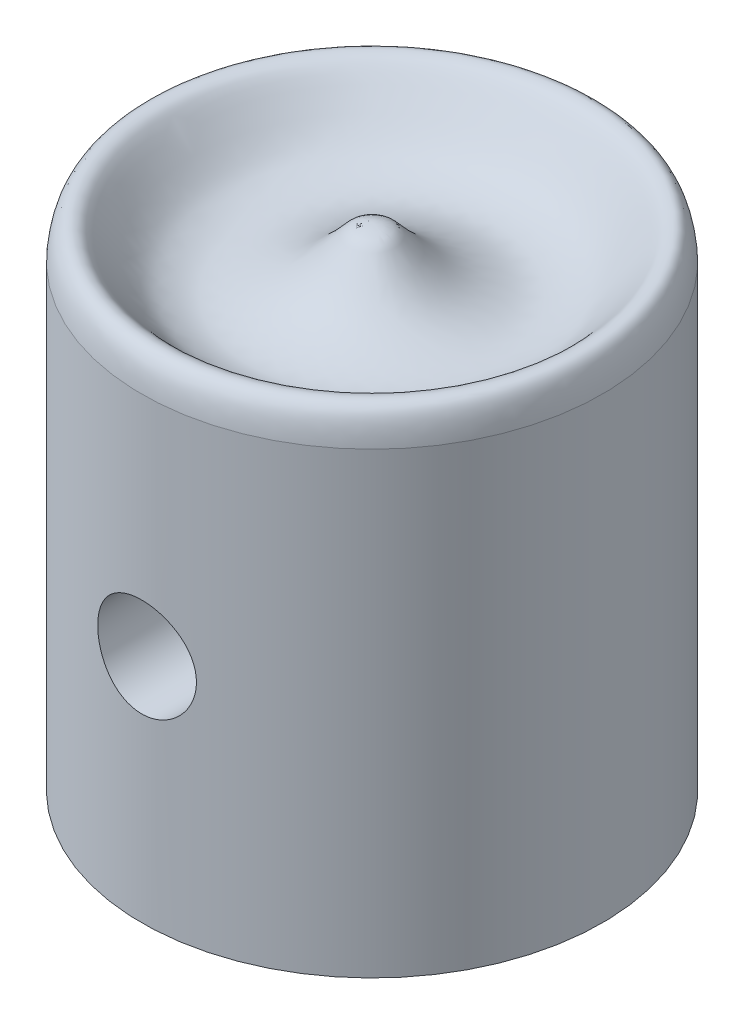
ISO-10303-21;
HEADER;
FILE_DESCRIPTION(('STEP AP214'),'2;1');
FILE_NAME('part.step','',(''),(''),'','','');
FILE_SCHEMA(('AUTOMOTIVE_DESIGN { 1 0 10303 214 1 1 1 1 }'));
ENDSEC;
DATA;
#1=APPLICATION_CONTEXT('core data for automotive mechanical design processes');
#2=APPLICATION_PROTOCOL_DEFINITION('international standard','automotive_design',2000,#1);
#3=PRODUCT_CONTEXT('',#1,'mechanical');
#4=PRODUCT('Part','Part','',(#3));
#5=PRODUCT_RELATED_PRODUCT_CATEGORY('part','',(#4));
#6=PRODUCT_DEFINITION_FORMATION('','',#4);
#7=PRODUCT_DEFINITION_CONTEXT('part definition',#1,'design');
#8=PRODUCT_DEFINITION('design','',#6,#7);
#9=PRODUCT_DEFINITION_SHAPE('','',#8);
#10=(LENGTH_UNIT() NAMED_UNIT(*) SI_UNIT(.MILLI.,.METRE.));
#11=(NAMED_UNIT(*) PLANE_ANGLE_UNIT() SI_UNIT($,.RADIAN.));
#12=(NAMED_UNIT(*) SI_UNIT($,.STERADIAN.) SOLID_ANGLE_UNIT());
#13=UNCERTAINTY_MEASURE_WITH_UNIT(LENGTH_MEASURE(1.E-05),#10,'distance_accuracy_value','');
#14=(GEOMETRIC_REPRESENTATION_CONTEXT(3) GLOBAL_UNCERTAINTY_ASSIGNED_CONTEXT((#13)) GLOBAL_UNIT_ASSIGNED_CONTEXT((#10,
#11,#12)) REPRESENTATION_CONTEXT('',''));
#15=CARTESIAN_POINT('',(0.,0.,0.));
#16=DIRECTION('',(0.,0.,1.));
#17=DIRECTION('',(1.,0.,0.));
#18=AXIS2_PLACEMENT_3D('',#15,#16,#17);
#19=CARTESIAN_POINT('',(1.10641825121042E-06,7.85800552250776,1.49375075862356E-05));
#20=DIRECTION('',(0.,-1.,0.));
#21=DIRECTION('',(0.,0.,-1.));
#22=AXIS2_PLACEMENT_3D('',#19,#20,#21);
#23=CONICAL_SURFACE('',#22,5.21420157956927,1.22173047639603);
#24=CARTESIAN_POINT('',(1.10641825121042E-06,9.75581969293477,1.49375075862356E-05));
#25=VERTEX_POINT('',#24);
#26=VERTEX_LOOP('',#25);
#27=FACE_BOUND('',#26,.T.);
#28=CARTESIAN_POINT('',(1.10641825121042E-06,7.85800552250776,1.49375075862356E-05));
#29=DIRECTION('',(0.,-1.,0.));
#30=DIRECTION('',(0.,0.,-1.));
#31=AXIS2_PLACEMENT_3D('',#28,#29,#30);
#32=CIRCLE('',#31,5.21420157956927);
#33=CARTESIAN_POINT('',(1.10641825121042E-06,7.85800552250776,-5.21418664206168));
#34=VERTEX_POINT('',#33);
#35=EDGE_CURVE('E79',#34,#34,#32,.T.);
#36=ORIENTED_EDGE('',*,*,#35,.T.);
#37=EDGE_LOOP('',(#36));
#38=FACE_BOUND('',#37,.T.);
#39=ADVANCED_FACE('F34',(#27,#38),#23,.F.);
#40=CARTESIAN_POINT('',(1.10641825920493E-06,13.0065583901349,1.49375075862356E-05));
#41=CARTESIAN_POINT('',(-0.281318869750762,13.0119064834803,1.49375075862356E-05));
#42=CARTESIAN_POINT('',(-0.771429325417088,12.9200708684947,1.49375075862356E-05));
#43=CARTESIAN_POINT('',(-1.48213317176714,12.0862238298535,1.49375075862356E-05));
#44=CARTESIAN_POINT('',(-2.43239731881508,11.0306937755032,1.49375075862356E-05));
#45=CARTESIAN_POINT('',(-4.88677950017906,10.1248266269099,1.49375075862356E-05));
#46=CARTESIAN_POINT('',(-5.89422209914828,10.1360366768638,1.49375075862356E-05));
#47=CARTESIAN_POINT('',(-7.76024358262324,10.9495093394525,1.49375075862356E-05));
#48=CARTESIAN_POINT('',(-9.02561356018783,12.8120332284387,1.49375075862356E-05));
#49=CARTESIAN_POINT('',(-9.85777476596087,13.1487752196153,1.49375075862356E-05));
#50=CARTESIAN_POINT('',(-10.3739114509213,12.9783097036479,1.49375075862356E-05));
#51=CARTESIAN_POINT('',(-10.4999988935818,11.5371236393169,1.49375075862356E-05));
#52=B_SPLINE_CURVE_WITH_KNOTS('',3,(#40,#41,#42,#43,#44,#45,#46,#47,#48,#49,#50,#51),
.UNSPECIFIED.,.F.,.F.,(4,1,1,1,1,1,1,1,1,4),(0.,0.0725474900971526,0.103319596306368,
0.285009788115958,0.33360778820772,0.540701597132226,0.586513163876913,0.745911888909903,
0.789253056585124,1.),.UNSPECIFIED.);
#53=CARTESIAN_POINT('',(1.10641825121042E-06,2.10017845414953,1.49375075862356E-05));
#54=DIRECTION('',(0.,-1.,0.));
#55=AXIS1_PLACEMENT('',#53,#54);
#56=SURFACE_OF_REVOLUTION('',#52,#55);
#57=CARTESIAN_POINT('',(1.10641825121042E-06,11.5371236393169,1.49375075862356E-05));
#58=DIRECTION('',(0.,-1.,0.));
#59=DIRECTION('',(0.,0.,-1.));
#60=AXIS2_PLACEMENT_3D('',#57,#58,#59);
#61=CIRCLE('',#60,10.5);
#62=CARTESIAN_POINT('',(1.10641825121042E-06,11.5371236393169,-10.4999850624924));
#63=VERTEX_POINT('',#62);
#64=EDGE_CURVE('E11',#63,#63,#61,.T.);
#65=ORIENTED_EDGE('',*,*,#64,.F.);
#66=EDGE_LOOP('',(#65));
#67=FACE_BOUND('',#66,.T.);
#68=CARTESIAN_POINT('',(1.10641825121042E-06,13.0065583901349,1.49375075862356E-05));
#69=VERTEX_POINT('',#68);
#70=VERTEX_LOOP('',#69);
#71=FACE_BOUND('',#70,.T.);
#72=ADVANCED_FACE('F54',(#67,#71),#56,.T.);
#73=CARTESIAN_POINT('',(1.10641825121042E-06,2.10017845414953,1.49375075862356E-05));
#74=DIRECTION('',(0.,-1.,0.));
#75=DIRECTION('',(0.,0.,-1.));
#76=AXIS2_PLACEMENT_3D('',#73,#74,#75);
#77=CYLINDRICAL_SURFACE('',#76,10.5);
#78=CARTESIAN_POINT('',(1.10641825121042E-06,3.4125317737881,-10.4999850624924));
#79=CARTESIAN_POINT('',(-0.124852722717674,3.41252742442665,-10.4999827531408));
#80=CARTESIAN_POINT('',(-0.249759686982161,3.40210436120632,-10.4977354517381));
#81=CARTESIAN_POINT('',(-0.49602991002174,3.36072828850772,-10.4889875099083));
#82=CARTESIAN_POINT('',(-0.617390498938534,3.3297602074957,-10.4824837470489));
#83=CARTESIAN_POINT('',(-0.852972879308354,3.24830522687605,-10.4659475393248));
#84=CARTESIAN_POINT('',(-0.967201838751582,3.19783830471613,-10.455918707));
#85=CARTESIAN_POINT('',(-1.18556616052293,3.07888064453121,-10.433416664762));
#86=CARTESIAN_POINT('',(-1.2897018662028,3.01039051991319,-10.4209435380423));
#87=CARTESIAN_POINT('',(-1.48653607938459,2.85621132427784,-10.3947056011871));
#88=CARTESIAN_POINT('',(-1.57905644487343,2.77029744094031,-10.3809253096413));
#89=CARTESIAN_POINT('',(-1.74848952942327,2.58419230026031,-10.3537361097046));
#90=CARTESIAN_POINT('',(-1.82540090084537,2.48399981141122,-10.3403272334669));
#91=CARTESIAN_POINT('',(-1.96221195927888,2.27087314449745,-10.3152468032008));
#92=CARTESIAN_POINT('',(-2.02192326860688,2.15781549715379,-10.3035951076578));
#93=CARTESIAN_POINT('',(-2.12143124894896,1.92298009313785,-10.2835699458705));
#94=CARTESIAN_POINT('',(-2.16123019860748,1.80120333604924,-10.2751961045531));
#95=CARTESIAN_POINT('',(-2.21919750991857,1.55431514390599,-10.2628321963871));
#96=CARTESIAN_POINT('',(-2.23768058980688,1.42928086029231,-10.2587784159397));
#97=CARTESIAN_POINT('',(-2.2534698216804,1.17782542502761,-10.255322160169));
#98=CARTESIAN_POINT('',(-2.25077846855119,1.05140443851818,-10.2559191368683));
#99=CARTESIAN_POINT('',(-2.22454878869467,0.803094741887414,-10.2616392115499));
#100=CARTESIAN_POINT('',(-2.20137487332287,0.681165440137873,-10.2666831877248));
#101=CARTESIAN_POINT('',(-2.1354147080619,0.44296641335409,-10.2806039631292));
#102=CARTESIAN_POINT('',(-2.09262739762873,0.326696994739622,-10.2894809696184));
#103=CARTESIAN_POINT('',(-1.98831715972161,0.102087464478095,-10.3101462738283));
#104=CARTESIAN_POINT('',(-1.92665305817419,-0.0061849952807243,-10.3219563772429));
#105=CARTESIAN_POINT('',(-1.78643900284165,-0.210980973648833,-10.3471436500117));
#106=CARTESIAN_POINT('',(-1.70788683513518,-0.307502949241201,-10.3605210247209));
#107=CARTESIAN_POINT('',(-1.53419203491155,-0.488157259721994,-10.3876758384006));
#108=CARTESIAN_POINT('',(-1.43873924452836,-0.571991286089004,-10.4014558220751));
#109=CARTESIAN_POINT('',(-1.23497485298539,-0.722508826746387,-10.4276103249483));
#110=CARTESIAN_POINT('',(-1.12666303674485,-0.78919205411248,-10.439984820632));
#111=CARTESIAN_POINT('',(-0.899899086656688,-0.903584246072291,-10.4619717405025));
#112=CARTESIAN_POINT('',(-0.781427281876973,-0.951255345078872,-10.4715786421427));
#113=CARTESIAN_POINT('',(-0.537903613610308,-1.02593169869352,-10.4869067011724));
#114=CARTESIAN_POINT('',(-0.412852670282252,-1.05293983505687,-10.4926284003982));
#115=CARTESIAN_POINT('',(-0.162280399836692,-1.08509254742703,-10.4994646577095));
#116=CARTESIAN_POINT('',(-0.0368136594891706,-1.09064479553457,-10.5006651103084));
#117=CARTESIAN_POINT('',(0.213254566893859,-1.08083136952415,-10.498563796532));
#118=CARTESIAN_POINT('',(0.337856108609134,-1.06546705426749,-10.4952623226279));
#119=CARTESIAN_POINT('',(0.58131491339246,-1.01459486071934,-10.4845822081714));
#120=CARTESIAN_POINT('',(0.700218675780967,-0.979299672003096,-10.4772466381743));
#121=CARTESIAN_POINT('',(0.930418782128378,-0.889802811719665,-10.4593189288151));
#122=CARTESIAN_POINT('',(1.04171449529986,-0.835599574744415,-10.448726519826));
#123=CARTESIAN_POINT('',(1.25523320336538,-0.708967911621407,-10.4252476283484));
#124=CARTESIAN_POINT('',(1.35730996908496,-0.636298533847305,-10.4123315328065));
#125=CARTESIAN_POINT('',(1.54796649470364,-0.475115988878793,-10.3857005580151));
#126=CARTESIAN_POINT('',(1.63654457445625,-0.386600852380732,-10.3719855796239));
#127=CARTESIAN_POINT('',(1.79929177228809,-0.194372170931193,-10.3450076530873));
#128=CARTESIAN_POINT('',(1.8731791652456,-0.0904180773787417,-10.3317569458117));
#129=CARTESIAN_POINT('',(2.00244733720886,0.128663668505093,-10.3074848808876));
#130=CARTESIAN_POINT('',(2.05782890512384,0.243790844254342,-10.2964634282132));
#131=CARTESIAN_POINT('',(2.14814722514647,0.481340222280009,-10.2780002096033));
#132=CARTESIAN_POINT('',(2.18319708603738,0.603717808434106,-10.2705386812369));
#133=CARTESIAN_POINT('',(2.23219154769828,0.852805149538558,-10.2600028631187));
#134=CARTESIAN_POINT('',(2.24613936812211,0.979514240590083,-10.256927904088));
#135=CARTESIAN_POINT('',(2.25240110530886,1.23083028855097,-10.2555543452147));
#136=CARTESIAN_POINT('',(2.24516131529292,1.35542579625897,-10.2571572102706));
#137=CARTESIAN_POINT('',(2.21024794751321,1.60157763698698,-10.2647365102649));
#138=CARTESIAN_POINT('',(2.18257459078794,1.72313400286796,-10.2707128978931));
#139=CARTESIAN_POINT('',(2.10779129552476,1.95941976059186,-10.2863187790548));
#140=CARTESIAN_POINT('',(2.06074381398155,2.07416974678454,-10.295936525863));
#141=CARTESIAN_POINT('',(1.94860238035226,2.29421483254838,-10.3177465313521));
#142=CARTESIAN_POINT('',(1.88350663594075,2.39950899171067,-10.3299390456979));
#143=CARTESIAN_POINT('',(1.73562546165781,2.59985906437615,-10.3558208963909));
#144=CARTESIAN_POINT('',(1.6525209177368,2.69467631770857,-10.3695347115763));
#145=CARTESIAN_POINT('',(1.47163093834768,2.86916616756879,-10.3967468094878));
#146=CARTESIAN_POINT('',(1.37384212049665,2.94883526525641,-10.4102450417619));
#147=CARTESIAN_POINT('',(1.16490582732133,3.09170571304645,-10.4357024282272));
#148=CARTESIAN_POINT('',(1.05360837543271,3.15469168313457,-10.4476405310518));
#149=CARTESIAN_POINT('',(0.821776347829149,3.26096356714738,-10.4684224540527));
#150=CARTESIAN_POINT('',(0.701249765214071,3.30426630766566,-10.4772689156776));
#151=CARTESIAN_POINT('',(0.483803932748057,3.36206005148483,-10.489257789419));
#152=CARTESIAN_POINT('',(0.38807691473722,3.38095142475815,-10.4932559408164));
#153=CARTESIAN_POINT('',(0.194911047699021,3.4061887263556,-10.4986204248132));
#154=CARTESIAN_POINT('',(0.0974722690513689,3.41253516925719,-10.4999868653621));
#155=CARTESIAN_POINT('',(1.10641825121042E-06,3.4125317737881,-10.4999850624924));
#156=B_SPLINE_CURVE_WITH_KNOTS('',3,(#78,#79,#80,#81,#82,#83,#84,#85,#86,#87,#88,#89,#90,#91,
#92,#93,#94,#95,#96,#97,#98,#99,#100,#101,#102,#103,#104,#105,#106,#107,#108,#109,#110,#111,
#112,#113,#114,#115,#116,#117,#118,#119,#120,#121,#122,#123,#124,#125,#126,#127,#128,#129,#130,
#131,#132,#133,#134,#135,#136,#137,#138,#139,#140,#141,#142,#143,#144,#145,#146,#147,#148,#149,
#150,#151,#152,#153,#154,#155),.UNSPECIFIED.,.T.,.F.,(4,2,2,2,2,2,2,2,2,2,2,2,2,2,2,2,2,2,2,2,2,
2,2,2,2,2,2,2,2,2,2,2,2,2,2,2,2,2,4),(0.,0.374204754768123,0.748684324829904,1.1227812366384,
1.49686541796883,1.87612442822598,2.2554161687776,2.63871643821766,3.02197283516234,
3.39949512186999,3.77697292753747,4.14786713179391,4.51878139356852,4.89254034248952,
5.26634831881334,5.64790516575436,6.02946839553525,6.41178781709709,6.79405390884515,
7.16901998556277,7.54396170347144,7.91497590883901,8.28602083797651,8.66218100801704,
9.03838795956727,9.42123094925301,9.80405761613708,10.1847336061271,10.5653515084378,
10.9380102081044,11.310664876624,11.6821274956018,12.0536270167743,12.4323442523117,
12.8111488559567,13.1946286553583,13.5777800101541,13.8699269869844,14.16206198006),.UNSPECIFIED.);
#157=CARTESIAN_POINT('',(1.10641825121042E-06,3.4125317737881,-10.4999850624924));
#158=VERTEX_POINT('',#157);
#159=EDGE_CURVE('E74',#158,#158,#156,.T.);
#160=ORIENTED_EDGE('',*,*,#159,.T.);
#161=EDGE_LOOP('',(#160));
#162=FACE_BOUND('',#161,.T.);
#163=CARTESIAN_POINT('',(2.25000110641825,1.1625317737881,10.2561106858906));
#164=CARTESIAN_POINT('',(2.2499967299984,1.03771504506358,10.2561132059165));
#165=CARTESIAN_POINT('',(2.23957965009002,0.912845112874495,10.2584140226431));
#166=CARTESIAN_POINT('',(2.19822949521299,0.666651765425523,10.267352613949));
#167=CARTESIAN_POINT('',(2.16728120122251,0.545331050773909,10.2739936056834));
#168=CARTESIAN_POINT('',(2.08588406168731,0.309833149426682,10.2908266669105));
#169=CARTESIAN_POINT('',(2.03545612128798,0.195648456605874,10.3010149283954));
#170=CARTESIAN_POINT('',(1.91659037151834,-0.0226411371287812,10.3237900002368));
#171=CARTESIAN_POINT('',(1.84815308714988,-0.126746331755502,10.3363767406706));
#172=CARTESIAN_POINT('',(1.69402824497157,-0.323612668435087,10.3627586194575));
#173=CARTESIAN_POINT('',(1.60810399867799,-0.416186540571841,10.3765686855839));
#174=CARTESIAN_POINT('',(1.42195536861262,-0.585723557820572,10.4037103131635));
#175=CARTESIAN_POINT('',(1.32172990174476,-0.662685519502,10.4170418382788));
#176=CARTESIAN_POINT('',(1.10857203911512,-0.799551392949048,10.4418864741491));
#177=CARTESIAN_POINT('',(0.995521838763182,-0.859275709867825,10.453379919799));
#178=CARTESIAN_POINT('',(0.760702510432144,-0.958809763381332,10.4730850031516));
#179=CARTESIAN_POINT('',(0.638934322488719,-0.998621643391317,10.4812969940575));
#180=CARTESIAN_POINT('',(0.392081887925519,-1.05661318260891,10.4934084167253));
#181=CARTESIAN_POINT('',(0.267075207313636,-1.07510961904054,10.4973709381834));
#182=CARTESIAN_POINT('',(0.0156745243782183,-1.09093514218178,10.5007553706126));
#183=CARTESIAN_POINT('',(-0.110719323828887,-1.08826655705303,10.5001777809981));
#184=CARTESIAN_POINT('',(-0.359124437457516,-1.06207477921652,10.494595450446));
#185=CARTESIAN_POINT('',(-0.481173566624918,-1.03889297577702,10.4896631847941));
#186=CARTESIAN_POINT('',(-0.719608089549332,-0.972876203434102,10.4760080613442));
#187=CARTESIAN_POINT('',(-0.83599323384433,-0.930040369762285,10.4672850367554));
#188=CARTESIAN_POINT('',(-1.06075013991658,-0.825626037879117,10.4469112572105));
#189=CARTESIAN_POINT('',(-1.16905937910543,-0.763917075405375,10.4352402245668));
#190=CARTESIAN_POINT('',(-1.37391028342602,-0.623605273966499,10.4102518436656));
#191=CARTESIAN_POINT('',(-1.47045040325904,-0.545000220261445,10.396934279678));
#192=CARTESIAN_POINT('',(-1.65105202558472,-0.3712654094201,10.3698048344215));
#193=CARTESIAN_POINT('',(-1.73482565338551,-0.275836857176344,10.3559883931004));
#194=CARTESIAN_POINT('',(-1.88523254210267,-0.0721432986091364,10.3296684399872));
#195=CARTESIAN_POINT('',(-1.95186537535277,0.0361220278959768,10.3171649609584));
#196=CARTESIAN_POINT('',(-2.0662200571812,0.262868525383744,10.2948752913084));
#197=CARTESIAN_POINT('',(-2.11388941991559,0.381376959566763,10.2850966644242));
#198=CARTESIAN_POINT('',(-2.18855132096848,0.624980922707763,10.2694700496068));
#199=CARTESIAN_POINT('',(-2.21554699400117,0.75007544995289,10.2636214657848));
#200=CARTESIAN_POINT('',(-2.24765268395153,1.00067540276267,10.2566381563393));
#201=CARTESIAN_POINT('',(-2.25318102251135,1.12612478640406,10.2554133432831));
#202=CARTESIAN_POINT('',(-2.24332598821735,1.37615276356065,10.2575735311175));
#203=CARTESIAN_POINT('',(-2.22794398980628,1.50073141376843,10.2609582290235));
#204=CARTESIAN_POINT('',(-2.17706731311551,1.74403742625924,10.2718711697707));
#205=CARTESIAN_POINT('',(-2.14180134735505,1.86281492268354,10.279352266623));
#206=CARTESIAN_POINT('',(-2.05240468778299,2.09277528008748,10.2975728355542));
#207=CARTESIAN_POINT('',(-1.99827224852402,2.20395743723939,10.3083126091003));
#208=CARTESIAN_POINT('',(-1.87175145983232,2.41738630092648,10.3320394487128));
#209=CARTESIAN_POINT('',(-1.79910442244363,2.51947614680638,10.3450574637023));
#210=CARTESIAN_POINT('',(-1.63795665108576,2.7101692925988,10.3717915679097));
#211=CARTESIAN_POINT('',(-1.54945403131416,2.7987709859608,10.3855077400245));
#212=CARTESIAN_POINT('',(-1.35721804021297,2.96158722820524,10.4123885373602));
#213=CARTESIAN_POINT('',(-1.2532412823249,3.03551714802362,10.4255389716238));
#214=CARTESIAN_POINT('',(-1.03410111550516,3.16485988781468,10.4495490982311));
#215=CARTESIAN_POINT('',(-0.918938217647357,3.22027355324735,10.460408895158));
#216=CARTESIAN_POINT('',(-0.681397022054809,3.31060985574582,10.4785541132312));
#217=CARTESIAN_POINT('',(-0.559068683194509,3.34565922940752,10.485861594563));
#218=CARTESIAN_POINT('',(-0.310086659086682,3.39466933238658,10.4961740270373));
#219=CARTESIAN_POINT('',(-0.183433578542733,3.40863299774896,10.4991795771922));
#220=CARTESIAN_POINT('',(0.0678966819974892,3.4149477524059,10.5005326026433));
#221=CARTESIAN_POINT('',(0.192562864682075,3.40772451169508,10.4989718225321));
#222=CARTESIAN_POINT('',(0.438860514042214,3.37281962850952,10.4915632229588));
#223=CARTESIAN_POINT('',(0.560492031026258,3.34513832542049,10.4857154746147));
#224=CARTESIAN_POINT('',(0.796954029149077,3.27030356441401,10.4703957670838));
#225=CARTESIAN_POINT('',(0.911803654027724,3.22320823971028,10.4609346339583));
#226=CARTESIAN_POINT('',(1.13202854150338,3.11093986703391,10.4394004782742));
#227=CARTESIAN_POINT('',(1.23740292361356,3.04576514132715,10.4273272133377));
#228=CARTESIAN_POINT('',(1.43776956676,2.89778829567604,10.4016120864995));
#229=CARTESIAN_POINT('',(1.5325366540727,2.81468553631348,10.3879455710298));
#230=CARTESIAN_POINT('',(1.70692612828711,2.63382085840524,10.360720288741));
#231=CARTESIAN_POINT('',(1.78654487737032,2.53605542872727,10.347161548551));
#232=CARTESIAN_POINT('',(1.92935003035496,2.32714603403367,10.3214953419231));
#233=CARTESIAN_POINT('',(1.99231457350708,2.21584773645402,10.3094085254929));
#234=CARTESIAN_POINT('',(2.09854617626028,1.98401619250048,10.2883123945916));
#235=CARTESIAN_POINT('',(2.1418302027637,1.86349100593421,10.2793004309182));
#236=CARTESIAN_POINT('',(2.19958021325081,1.64609257699384,10.2670733473763));
#237=CARTESIAN_POINT('',(2.21845239403689,1.55041426022219,10.2629891838914));
#238=CARTESIAN_POINT('',(2.24366426706732,1.3573453064263,10.2575069300092));
#239=CARTESIAN_POINT('',(2.25000452233723,1.25995474652687,10.2561087189394));
#240=CARTESIAN_POINT('',(2.25000110641825,1.1625317737881,10.2561106858906));
#241=B_SPLINE_CURVE_WITH_KNOTS('',3,(#163,#164,#165,#166,#167,#168,#169,#170,#171,#172,#173,
#174,#175,#176,#177,#178,#179,#180,#181,#182,#183,#184,#185,#186,#187,#188,#189,#190,#191,#192,
#193,#194,#195,#196,#197,#198,#199,#200,#201,#202,#203,#204,#205,#206,#207,#208,#209,#210,#211,
#212,#213,#214,#215,#216,#217,#218,#219,#220,#221,#222,#223,#224,#225,#226,#227,#228,#229,#230,
#231,#232,#233,#234,#235,#236,#237,#238,#239,#240),.UNSPECIFIED.,.T.,.F.,(4,2,2,2,2,2,2,2,2,2,2,
2,2,2,2,2,2,2,2,2,2,2,2,2,2,2,2,2,2,2,2,2,2,2,2,2,2,2,4),(0.,0.374093223041292,
0.748464057719946,1.12243423672914,1.49639351510292,1.87579844374038,2.25523212169318,
2.63848702230417,3.02170065969401,3.39914262227893,3.77654306665861,4.14777836501057,
4.51902999911376,4.89290832215156,5.26683568308472,5.64823441168942,6.02964265534638,
6.41209931117671,6.79449796430758,7.16940649788784,7.54429038980875,7.91494771124062,
8.28563933344725,8.66182515324477,9.03805574488617,9.42099322024815,9.80391320813312,
10.1844238473656,10.5648814981281,10.9377479946619,11.3106083057265,11.6823601442922,
12.0541464922705,12.4327337124145,12.8114117344685,13.1949057025222,13.5780684242056,
13.8700718418644,14.1620621403007),.UNSPECIFIED.);
#242=CARTESIAN_POINT('',(2.25000110641825,1.1625317737881,10.2561106858906));
#243=VERTEX_POINT('',#242);
#244=EDGE_CURVE('E116',#243,#243,#241,.T.);
#245=ORIENTED_EDGE('',*,*,#244,.T.);
#246=EDGE_LOOP('',(#245));
#247=FACE_BOUND('',#246,.T.);
#248=CARTESIAN_POINT('',(1.10641825121042E-06,-9.3374682262119,1.49375075862356E-05));
#249=DIRECTION('',(0.,-1.,0.));
#250=DIRECTION('',(0.,0.,-1.));
#251=AXIS2_PLACEMENT_3D('',#248,#249,#250);
#252=CIRCLE('',#251,10.5);
#253=CARTESIAN_POINT('',(1.10641825121042E-06,-9.3374682262119,-10.4999850624924));
#254=VERTEX_POINT('',#253);
#255=EDGE_CURVE('E47',#254,#254,#252,.T.);
#256=ORIENTED_EDGE('',*,*,#255,.F.);
#257=EDGE_LOOP('',(#256));
#258=FACE_BOUND('',#257,.T.);
#259=ORIENTED_EDGE('',*,*,#64,.T.);
#260=EDGE_LOOP('',(#259));
#261=FACE_BOUND('',#260,.T.);
#262=ADVANCED_FACE('F56',(#162,#247,#258,#261),#77,.T.);
#263=CARTESIAN_POINT('',(-10.4999988935817,-9.3374682262119,1.49375075862356E-05));
#264=DIRECTION('',(0.,1.,0.));
#265=DIRECTION('',(0.,0.,1.));
#266=AXIS2_PLACEMENT_3D('',#263,#264,#265);
#267=PLANE('',#266);
#268=CARTESIAN_POINT('',(1.10641825121042E-06,-9.3374682262119,1.49375075862356E-05));
#269=DIRECTION('',(0.,-1.,0.));
#270=DIRECTION('',(0.,0.,-1.));
#271=AXIS2_PLACEMENT_3D('',#268,#269,#270);
#272=CIRCLE('',#271,9.375);
#273=CARTESIAN_POINT('',(1.10641825121042E-06,-9.3374682262119,-9.37498506249241));
#274=VERTEX_POINT('',#273);
#275=EDGE_CURVE('E94',#274,#274,#272,.T.);
#276=ORIENTED_EDGE('',*,*,#275,.F.);
#277=EDGE_LOOP('',(#276));
#278=FACE_BOUND('',#277,.T.);
#279=ORIENTED_EDGE('',*,*,#255,.T.);
#280=EDGE_LOOP('',(#279));
#281=FACE_BOUND('',#280,.T.);
#282=ADVANCED_FACE('F62',(#278,#281),#267,.F.);
#283=CARTESIAN_POINT('',(1.10641825121042E-06,-9.3374682262119,1.49375075862356E-05));
#284=DIRECTION('',(0.,-1.,0.));
#285=DIRECTION('',(0.,0.,-1.));
#286=AXIS2_PLACEMENT_3D('',#283,#284,#285);
#287=CONICAL_SURFACE('',#286,9.375,0.349065850398866);
#288=CARTESIAN_POINT('',(1.10641825121042E-06,-4.39432411044913,1.49375075862356E-05));
#289=DIRECTION('',(0.,-1.,0.));
#290=DIRECTION('',(0.,0.,-1.));
#291=AXIS2_PLACEMENT_3D('',#288,#289,#290);
#292=CIRCLE('',#291,7.57584267817422);
#293=CARTESIAN_POINT('',(1.10641825121042E-06,-4.39432411044913,-7.57582774066664));
#294=VERTEX_POINT('',#293);
#295=EDGE_CURVE('E91',#294,#294,#292,.T.);
#296=ORIENTED_EDGE('',*,*,#295,.F.);
#297=EDGE_LOOP('',(#296));
#298=FACE_BOUND('',#297,.T.);
#299=ORIENTED_EDGE('',*,*,#275,.T.);
#300=EDGE_LOOP('',(#299));
#301=FACE_BOUND('',#300,.T.);
#302=ADVANCED_FACE('F135',(#298,#301),#287,.F.);
#303=CARTESIAN_POINT('',(1.10641825121042E-06,-1.8374682262119,1.49375075862356E-05));
#304=DIRECTION('',(0.,-1.,0.));
#305=DIRECTION('',(0.,0.,-1.));
#306=AXIS2_PLACEMENT_3D('',#303,#304,#305);
#307=TOROIDAL_SURFACE('',#306,14.6007464849157,7.47574648491569);
#308=CARTESIAN_POINT('',(1.10641825121042E-06,-1.8374682262119,1.49375075862356E-05));
#309=DIRECTION('',(0.,-1.,0.));
#310=DIRECTION('',(0.,0.,-1.));
#311=AXIS2_PLACEMENT_3D('',#308,#309,#310);
#312=CIRCLE('',#311,7.125);
#313=CARTESIAN_POINT('',(1.10641825121042E-06,-1.8374682262119,-7.12498506249242));
#314=VERTEX_POINT('',#313);
#315=EDGE_CURVE('E88',#314,#314,#312,.T.);
#316=ORIENTED_EDGE('',*,*,#315,.F.);
#317=EDGE_LOOP('',(#316));
#318=FACE_BOUND('',#317,.T.);
#319=ORIENTED_EDGE('',*,*,#295,.T.);
#320=EDGE_LOOP('',(#319));
#321=FACE_BOUND('',#320,.T.);
#322=ADVANCED_FACE('F140',(#318,#321),#307,.T.);
#323=CARTESIAN_POINT('',(1.10641825121042E-06,2.10017845414953,1.49375075862356E-05));
#324=DIRECTION('',(0.,-1.,0.));
#325=DIRECTION('',(0.,0.,-1.));
#326=AXIS2_PLACEMENT_3D('',#323,#324,#325);
#327=CYLINDRICAL_SURFACE('',#326,7.125);
#328=CARTESIAN_POINT('',(1.10641825121042E-06,3.4125317737881,-7.12498506249241));
#329=CARTESIAN_POINT('',(0.123126423515358,3.41253116779245,-7.12498458106163));
#330=CARTESIAN_POINT('',(0.246258351170992,3.40239196954619,-7.12176349654327));
#331=CARTESIAN_POINT('',(0.488917281365497,3.36221209995333,-7.10922978386408));
#332=CARTESIAN_POINT('',(0.608443531606935,3.3321673050722,-7.09991589355598));
#333=CARTESIAN_POINT('',(0.840357010674767,3.25329333951209,-7.07621321029776));
#334=CARTESIAN_POINT('',(0.952755107554676,3.20449360712766,-7.06183237350332));
#335=CARTESIAN_POINT('',(1.16777297522907,3.08962146914507,-7.0294780014859));
#336=CARTESIAN_POINT('',(1.27039113900774,3.02354623153045,-7.01150387732022));
#337=CARTESIAN_POINT('',(1.46616572455,2.87381076764847,-6.97323571242462));
#338=CARTESIAN_POINT('',(1.55897130525148,2.78970500068293,-6.95289033770123));
#339=CARTESIAN_POINT('',(1.72942224562713,2.60724435360395,-6.91246771601906));
#340=CARTESIAN_POINT('',(1.8070647068434,2.50888675547398,-6.89239052100527));
#341=CARTESIAN_POINT('',(1.9469031092219,2.29765860061429,-6.85422451529019));
#342=CARTESIAN_POINT('',(2.00865803670583,2.18448356862189,-6.83619894233624));
#343=CARTESIAN_POINT('',(2.11211194632678,1.94869308112374,-6.80495049377524));
#344=CARTESIAN_POINT('',(2.15381633893496,1.82608018272009,-6.79172632278561));
#345=CARTESIAN_POINT('',(2.21469656801252,1.57885842023394,-6.7721154716978));
#346=CARTESIAN_POINT('',(2.23452426053356,1.4544261721749,-6.7655314844912));
#347=CARTESIAN_POINT('',(2.25312496735797,1.20384042645832,-6.75936097902893));
#348=CARTESIAN_POINT('',(2.25190371549636,1.07768740690328,-6.7597725551473));
#349=CARTESIAN_POINT('',(2.22895046348897,0.83265849552975,-6.76737270454775));
#350=CARTESIAN_POINT('',(2.20805042828008,0.713694699426856,-6.77428637344187));
#351=CARTESIAN_POINT('',(2.14768307650213,0.481056982624202,-6.79366462362354));
#352=CARTESIAN_POINT('',(2.10821374851298,0.367383636450556,-6.80612980624154));
#353=CARTESIAN_POINT('',(2.01124736768729,0.14658587197462,-6.83541495187793));
#354=CARTESIAN_POINT('',(1.95349136429026,0.0395837390558796,-6.85229682099157));
#355=CARTESIAN_POINT('',(1.82177093179248,-0.163481462736257,-6.88848519048684));
#356=CARTESIAN_POINT('',(1.74780221779746,-0.259541629513631,-6.90779233127208));
#357=CARTESIAN_POINT('',(1.58168693286395,-0.44269526845965,-6.94775538553571));
#358=CARTESIAN_POINT('',(1.48885454880514,-0.529163319823082,-6.9684322509937));
#359=CARTESIAN_POINT('',(1.28974990731504,-0.685458086617052,-7.00801345162434));
#360=CARTESIAN_POINT('',(1.18347661260262,-0.755283516478514,-7.02691764979789));
#361=CARTESIAN_POINT('',(0.959282972874609,-0.876746792924062,-7.06102931328048));
#362=CARTESIAN_POINT('',(0.841275211262591,-0.928232645248492,-7.07620557535656));
#363=CARTESIAN_POINT('',(0.597682515955759,-1.01043539291486,-7.10092600908795));
#364=CARTESIAN_POINT('',(0.472099946955938,-1.0411587336965,-7.1104719284895));
#365=CARTESIAN_POINT('',(0.222229019419845,-1.07989241492062,-7.1225735933352));
#366=CARTESIAN_POINT('',(0.0980842883477371,-1.08874917491542,-7.12538969346507));
#367=CARTESIAN_POINT('',(-0.149932427802379,-1.08588855008735,-7.1244860993858));
#368=CARTESIAN_POINT('',(-0.273804450888321,-1.07417424151887,-7.1207673824112));
#369=CARTESIAN_POINT('',(-0.514475803259906,-1.03118209138579,-7.10738321441351));
#370=CARTESIAN_POINT('',(-0.631374923502791,-1.00041033929277,-7.09787170211123));
#371=CARTESIAN_POINT('',(-0.858316251208657,-0.920796666507333,-7.0740183215966));
#372=CARTESIAN_POINT('',(-0.968357604636118,-0.871952500391064,-7.0596758531775));
#373=CARTESIAN_POINT('',(-1.18148346541697,-0.756233591116342,-7.0271917752273));
#374=CARTESIAN_POINT('',(-1.2843290420748,-0.688943340602294,-7.00896508671702));
#375=CARTESIAN_POINT('',(-1.47755124096363,-0.538739244522794,-6.9707942029503));
#376=CARTESIAN_POINT('',(-1.5679244018178,-0.45582107690075,-6.95084953339954));
#377=CARTESIAN_POINT('',(-1.73743896043132,-0.272733331097918,-6.91047230224624));
#378=CARTESIAN_POINT('',(-1.81597689909345,-0.172000885354719,-6.89005271581591));
#379=CARTESIAN_POINT('',(-1.95509149353741,0.0416568316032217,-6.85187965952222));
#380=CARTESIAN_POINT('',(-2.01566837689259,0.15458194830749,-6.83412615587998));
#381=CARTESIAN_POINT('',(-2.11677712496248,0.389224697109054,-6.8034895061148));
#382=CARTESIAN_POINT('',(-2.1573816891265,0.510908564174487,-6.79058873695905));
#383=CARTESIAN_POINT('',(-2.21737347493743,0.759878973972046,-6.77123958953326));
#384=CARTESIAN_POINT('',(-2.23676899224927,0.887163305870265,-6.76478868855909));
#385=CARTESIAN_POINT('',(-2.25318820266777,1.13740216268341,-6.7593363143071));
#386=CARTESIAN_POINT('',(-2.25120360485137,1.26028521378578,-6.76000460325927));
#387=CARTESIAN_POINT('',(-2.22732014150793,1.5038742606175,-6.76791086583304));
#388=CARTESIAN_POINT('',(-2.20542224216557,1.62458036168175,-6.77514852071184));
#389=CARTESIAN_POINT('',(-2.14300374251577,1.85857447996188,-6.7951448490648));
#390=CARTESIAN_POINT('',(-2.10277265326631,1.97194763297062,-6.80781751812045));
#391=CARTESIAN_POINT('',(-2.00505864831645,2.1904247674713,-6.83723244623693));
#392=CARTESIAN_POINT('',(-1.94757217059001,2.2955270359468,-6.85397554541999));
#393=CARTESIAN_POINT('',(-1.81430199553865,2.49901189173439,-6.89047682937481));
#394=CARTESIAN_POINT('',(-1.73788066301573,2.5969600361907,-6.91032855002858));
#395=CARTESIAN_POINT('',(-1.5700252545626,2.77896303023414,-6.95038628058944));
#396=CARTESIAN_POINT('',(-1.47858712908547,2.8630141199288,-6.97059238474594));
#397=CARTESIAN_POINT('',(-1.27959838321767,3.01766716024574,-7.00989670792672));
#398=CARTESIAN_POINT('',(-1.17160962885459,3.0877223598826,-7.02893489405298));
#399=CARTESIAN_POINT('',(-0.944788102846037,3.20859430034459,-7.06299575113748));
#400=CARTESIAN_POINT('',(-0.825959391539814,3.25941820823998,-7.07801991741594));
#401=CARTESIAN_POINT('',(-0.590452766048472,3.33692992744294,-7.10138470870367));
#402=CARTESIAN_POINT('',(-0.474336593361405,3.36519759316649,-7.11015697015641));
#403=CARTESIAN_POINT('',(-0.238814847507597,3.40299681778477,-7.12195676960882));
#404=CARTESIAN_POINT('',(-0.119409979415876,3.41253236150313,-7.12498552940022));
#405=CARTESIAN_POINT('',(1.10641825121042E-06,3.4125317737881,-7.12498506249241));
#406=B_SPLINE_CURVE_WITH_KNOTS('',3,(#328,#329,#330,#331,#332,#333,#334,#335,#336,#337,#338,
#339,#340,#341,#342,#343,#344,#345,#346,#347,#348,#349,#350,#351,#352,#353,#354,#355,#356,#357,
#358,#359,#360,#361,#362,#363,#364,#365,#366,#367,#368,#369,#370,#371,#372,#373,#374,#375,#376,
#377,#378,#379,#380,#381,#382,#383,#384,#385,#386,#387,#388,#389,#390,#391,#392,#393,#394,#395,
#396,#397,#398,#399,#400,#401,#402,#403,#404,#405),.UNSPECIFIED.,.T.,.F.,(4,2,2,2,2,2,2,2,2,2,2,
2,2,2,2,2,2,2,2,2,2,2,2,2,2,2,2,2,2,2,2,2,2,2,2,2,2,2,4),(0.,0.368936956279035,
0.737950363426831,1.10638690651349,1.4748838862292,1.85383074912876,2.23284997766309,
2.62146853564894,3.00998216918917,3.38657747436771,3.76307019477174,4.12432817725207,
4.48562530009869,4.85228645746297,5.2190446376417,5.60287271109721,5.98673042397576,
6.37369924387384,6.76054787930612,7.13216952810688,7.50373560831266,7.86583408590447,
8.22797756787321,8.59906486784471,8.97025494671013,9.3564849882041,9.74271013580861,
10.1275188197047,10.5121769363906,10.8790726445808,11.2459505521015,11.6072255414006,
11.9685751599655,12.3443187866269,12.7201639061633,13.1086368233147,13.4969648224154,
13.8548484674225,14.2126559727536),.UNSPECIFIED.);
#407=CARTESIAN_POINT('',(1.10641825121042E-06,3.4125317737881,-7.12498506249241));
#408=VERTEX_POINT('',#407);
#409=EDGE_CURVE('E37',#408,#408,#406,.T.);
#410=ORIENTED_EDGE('',*,*,#409,.T.);
#411=EDGE_LOOP('',(#410));
#412=FACE_BOUND('',#411,.T.);
#413=CARTESIAN_POINT('',(2.25000110641825,1.1625317737881,6.76042357900257));
#414=CARTESIAN_POINT('',(2.25000047648598,1.28548419780232,6.76042418023962));
#415=CARTESIAN_POINT('',(2.23988870989348,1.40844324937522,6.76381450061886));
#416=CARTESIAN_POINT('',(2.19982767972466,1.65074428803728,6.77694792557474));
#417=CARTESIAN_POINT('',(2.16987338838705,1.77008535037213,6.786692640238));
#418=CARTESIAN_POINT('',(2.09126373170711,2.0016050780624,6.81132345931652));
#419=CARTESIAN_POINT('',(2.04264199947942,2.11379620400537,6.82620031229857));
#420=CARTESIAN_POINT('',(1.9281903062018,2.32846085779508,6.85940621742129));
#421=CARTESIAN_POINT('',(1.86235718394463,2.43093259577005,6.87773590356903));
#422=CARTESIAN_POINT('',(1.71287788098741,2.62684478096619,6.91650344453939));
#423=CARTESIAN_POINT('',(1.62873156382458,2.71989411939197,6.93698982099639));
#424=CARTESIAN_POINT('',(1.44608423938385,2.89082330302336,6.97735000390485));
#425=CARTESIAN_POINT('',(1.34758118676891,2.96870098309357,6.99722372258425));
#426=CARTESIAN_POINT('',(1.13619836147085,3.10880953297618,7.03467542624614));
#427=CARTESIAN_POINT('',(1.02303860800246,3.17063654134313,7.05218963069238));
#428=CARTESIAN_POINT('',(0.787279207553588,3.27422765962497,7.08238153275095));
#429=CARTESIAN_POINT('',(0.664681837249889,3.31599659074733,7.09506039244736));
#430=CARTESIAN_POINT('',(0.417623270158464,3.37697687043978,7.1138095602588));
#431=CARTESIAN_POINT('',(0.29334223313342,3.39685692597219,7.12007533712206));
#432=CARTESIAN_POINT('',(0.043061199333696,3.41561502993445,7.12598325561208));
#433=CARTESIAN_POINT('',(-0.082938391885884,3.41449795055321,7.12562693383515));
#434=CARTESIAN_POINT('',(-0.328369322609538,3.39173097445429,7.11846634776006));
#435=CARTESIAN_POINT('',(-0.447875636051524,3.37080619921286,7.11188980099542));
#436=CARTESIAN_POINT('',(-0.681584361213981,3.31020903731243,7.0933086797995));
#437=CARTESIAN_POINT('',(-0.795786424085585,3.27053541949548,7.0813037489112));
#438=CARTESIAN_POINT('',(-1.01730437259429,3.173107500961,7.05291149090484));
#439=CARTESIAN_POINT('',(-1.12451741352518,3.11513528227465,7.03647171150228));
#440=CARTESIAN_POINT('',(-1.3279175471504,2.98293130190688,7.00093868551963));
#441=CARTESIAN_POINT('',(-1.42410179718359,2.90869536255281,6.98184475762814));
#442=CARTESIAN_POINT('',(-1.60703645519447,2.74235882443772,6.94207478339402));
#443=CARTESIAN_POINT('',(-1.69321197320009,2.64963292271685,6.92136598593534));
#444=CARTESIAN_POINT('',(-1.84896340940695,2.45085453531176,6.88139832422262));
#445=CARTESIAN_POINT('',(-1.91853728522849,2.34480041240069,6.8621396385646));
#446=CARTESIAN_POINT('',(-2.03979847395022,2.12072161606406,6.82708529810296));
#447=CARTESIAN_POINT('',(-2.09126834812508,2.0025720659596,6.81133252475259));
#448=CARTESIAN_POINT('',(-2.17339903031569,1.75866462131388,6.78557542064151));
#449=CARTESIAN_POINT('',(-2.20406750313162,1.63290954784308,6.77556897271111));
#450=CARTESIAN_POINT('',(-2.24260632328015,1.38287823328123,6.76290884468435));
#451=CARTESIAN_POINT('',(-2.25135872291327,1.25875226826433,6.75997088172152));
#452=CARTESIAN_POINT('',(-2.24829660306108,1.010795199844,6.76099024941426));
#453=CARTESIAN_POINT('',(-2.23648534439184,0.886964052808683,6.76494648684423));
#454=CARTESIAN_POINT('',(-2.19342016255627,0.646941741940459,6.77902738738069));
#455=CARTESIAN_POINT('',(-2.16275468145134,0.53063289278729,6.78896517528315));
#456=CARTESIAN_POINT('',(-2.08354474387681,0.304825875070276,6.813690270261));
#457=CARTESIAN_POINT('',(-2.03499733089664,0.195328836238875,6.82847837922027));
#458=CARTESIAN_POINT('',(-1.91978700559557,-0.0172807817942697,6.86177302501002));
#459=CARTESIAN_POINT('',(-1.85263710679807,-0.12011406862271,6.88037542027082));
#460=CARTESIAN_POINT('',(-1.70269387382649,-0.313373794849722,6.91900610178529));
#461=CARTESIAN_POINT('',(-1.61989639054075,-0.403796932571989,6.93903476534828));
#462=CARTESIAN_POINT('',(-1.43682794987843,-0.573630891123888,6.97929013933523));
#463=CARTESIAN_POINT('',(-1.3359643912464,-0.652411200544517,6.9994891574422));
#464=CARTESIAN_POINT('',(-1.12195893452767,-0.791955188498893,7.03696127446));
#465=CARTESIAN_POINT('',(-1.00881758335151,-0.852719669092624,7.05423450361151));
#466=CARTESIAN_POINT('',(-0.77414782625802,-0.953926770009345,7.08381246813018));
#467=CARTESIAN_POINT('',(-0.652686815731462,-0.994514773888679,7.09615261904658));
#468=CARTESIAN_POINT('',(-0.404202992819551,-1.05454779272639,7.11462949760774));
#469=CARTESIAN_POINT('',(-0.277181975085291,-1.07399957840977,7.12076821176143));
#470=CARTESIAN_POINT('',(-0.0269818664634861,-1.09064868111069,7.12601608509644));
#471=CARTESIAN_POINT('',(0.0961313606490468,-1.08875583028443,7.12541264444124));
#472=CARTESIAN_POINT('',(0.340205937862798,-1.06497640820783,7.11793537255177));
#473=CARTESIAN_POINT('',(0.461167432789565,-1.04309118780432,7.11106196496742));
#474=CARTESIAN_POINT('',(0.695955861564999,-0.98053163629757,7.09191030807032));
#475=CARTESIAN_POINT('',(0.809855115579717,-0.940105327090501,7.0797035020123));
#476=CARTESIAN_POINT('',(1.02930762419286,-0.841835941319978,7.05114335444843));
#477=CARTESIAN_POINT('',(1.13485942908752,-0.783989847808111,7.03478929475345));
#478=CARTESIAN_POINT('',(1.33857434148915,-0.650222247001688,6.9989374979453));
#479=CARTESIAN_POINT('',(1.43635818581904,-0.573747219103411,6.97935094541959));
#480=CARTESIAN_POINT('',(1.61800625287785,-0.40586340746421,6.93949250703785));
#481=CARTESIAN_POINT('',(1.70186625279755,-0.31445010987779,6.91922041550777));
#482=CARTESIAN_POINT('',(1.85617029200064,-0.115556062053693,6.87946517850418));
#483=CARTESIAN_POINT('',(1.92606044377194,-0.00763427882479283,6.86003238275399));
#484=CARTESIAN_POINT('',(2.0466395191583,0.219010858869103,6.82503211394814));
#485=CARTESIAN_POINT('',(2.09733580215302,0.337730051655628,6.80946316019519));
#486=CARTESIAN_POINT('',(2.17462461397146,0.572951452644964,6.78515693575147));
#487=CARTESIAN_POINT('',(2.20280633746509,0.688886442574956,6.77597674938984));
#488=CARTESIAN_POINT('',(2.24049246132296,0.924056712566963,6.7636105586378));
#489=CARTESIAN_POINT('',(2.25000171733367,1.04329112645568,6.76042299591609));
#490=CARTESIAN_POINT('',(2.25000110641825,1.1625317737881,6.76042357900257));
#491=B_SPLINE_CURVE_WITH_KNOTS('',3,(#413,#414,#415,#416,#417,#418,#419,#420,#421,#422,#423,
#424,#425,#426,#427,#428,#429,#430,#431,#432,#433,#434,#435,#436,#437,#438,#439,#440,#441,#442,
#443,#444,#445,#446,#447,#448,#449,#450,#451,#452,#453,#454,#455,#456,#457,#458,#459,#460,#461,
#462,#463,#464,#465,#466,#467,#468,#469,#470,#471,#472,#473,#474,#475,#476,#477,#478,#479,#480,
#481,#482,#483,#484,#485,#486,#487,#488,#489,#490),.UNSPECIFIED.,.T.,.F.,(4,2,2,2,2,2,2,2,2,2,2,
2,2,2,2,2,2,2,2,2,2,2,2,2,2,2,2,2,2,2,2,2,2,2,2,2,2,2,4),(0.,0.368416635868909,
0.736926658028676,1.10477582826865,1.47269260870136,1.85231600946379,2.23199354636009,
2.62045867345783,3.00883038135359,3.38497640370905,3.76103514597346,4.12383870019151,
4.48666608151025,4.85398865403345,5.22140569180914,5.6044425203106,5.98752644679031,
6.37506578961951,6.76246225612876,7.13399680232382,7.50547243898702,7.86590462139821,
8.22639642266008,8.59740060479462,8.96850330073329,9.35536120904717,9.74220189196121,
10.1262132212911,10.5101015010624,10.8776903298101,11.2452543231083,11.6080387530619,
11.9708860501539,12.3462199054643,12.7216673845383,13.1098958382165,13.4979752848818,
13.8553628414338,14.2126574495008),.UNSPECIFIED.);
#492=CARTESIAN_POINT('',(2.25000110641825,1.1625317737881,6.76042357900257));
#493=VERTEX_POINT('',#492);
#494=EDGE_CURVE('E98',#493,#493,#491,.T.);
#495=ORIENTED_EDGE('',*,*,#494,.T.);
#496=EDGE_LOOP('',(#495));
#497=FACE_BOUND('',#496,.T.);
#498=CARTESIAN_POINT('',(1.10641825121042E-06,5.12910256708364,1.49375075862356E-05));
#499=DIRECTION('',(0.,-1.,0.));
#500=DIRECTION('',(0.,0.,-1.));
#501=AXIS2_PLACEMENT_3D('',#498,#499,#500);
#502=CIRCLE('',#501,7.125);
#503=CARTESIAN_POINT('',(1.10641825121042E-06,5.12910256708364,-7.12498506249241));
#504=VERTEX_POINT('',#503);
#505=EDGE_CURVE('E85',#504,#504,#502,.T.);
#506=ORIENTED_EDGE('',*,*,#505,.F.);
#507=EDGE_LOOP('',(#506));
#508=FACE_BOUND('',#507,.T.);
#509=ORIENTED_EDGE('',*,*,#315,.T.);
#510=EDGE_LOOP('',(#509));
#511=FACE_BOUND('',#510,.T.);
#512=ADVANCED_FACE('F103',(#412,#497,#508,#511),#327,.F.);
#513=CARTESIAN_POINT('',(1.10641825121042E-06,5.12910256708364,1.49375075862356E-05));
#514=DIRECTION('',(0.,-1.,0.));
#515=DIRECTION('',(0.,0.,-1.));
#516=AXIS2_PLACEMENT_3D('',#513,#514,#515);
#517=TOROIDAL_SURFACE('',#516,4.22096213159383,2.90403786840617);
#518=ORIENTED_EDGE('',*,*,#35,.F.);
#519=EDGE_LOOP('',(#518));
#520=FACE_BOUND('',#519,.T.);
#521=ORIENTED_EDGE('',*,*,#505,.T.);
#522=EDGE_LOOP('',(#521));
#523=FACE_BOUND('',#522,.T.);
#524=ADVANCED_FACE('F112',(#520,#523),#517,.F.);
#525=CARTESIAN_POINT('',(1.10641825121042E-06,1.1625317737881,-10.4999850624924));
#526=DIRECTION('',(0.,0.,1.));
#527=DIRECTION('',(1.,0.,0.));
#528=AXIS2_PLACEMENT_3D('',#525,#526,#527);
#529=CYLINDRICAL_SURFACE('',#528,2.25);
#530=ORIENTED_EDGE('',*,*,#494,.F.);
#531=EDGE_LOOP('',(#530));
#532=FACE_BOUND('',#531,.T.);
#533=ORIENTED_EDGE('',*,*,#244,.F.);
#534=EDGE_LOOP('',(#533));
#535=FACE_BOUND('',#534,.T.);
#536=ADVANCED_FACE('F110',(#532,#535),#529,.F.);
#537=ORIENTED_EDGE('',*,*,#409,.F.);
#538=EDGE_LOOP('',(#537));
#539=FACE_BOUND('',#538,.T.);
#540=ORIENTED_EDGE('',*,*,#159,.F.);
#541=EDGE_LOOP('',(#540));
#542=FACE_BOUND('',#541,.T.);
#543=ADVANCED_FACE('F107',(#539,#542),#529,.F.);
#544=CLOSED_SHELL('',(#39,#72,#262,#282,#302,#322,#512,#524,#536,#543));
#545=MANIFOLD_SOLID_BREP('B2',#544);
#546=ADVANCED_BREP_SHAPE_REPRESENTATION('',(#18,#545),#14);
#547=SHAPE_DEFINITION_REPRESENTATION(#9,#546);
ENDSEC;
END-ISO-10303-21;
